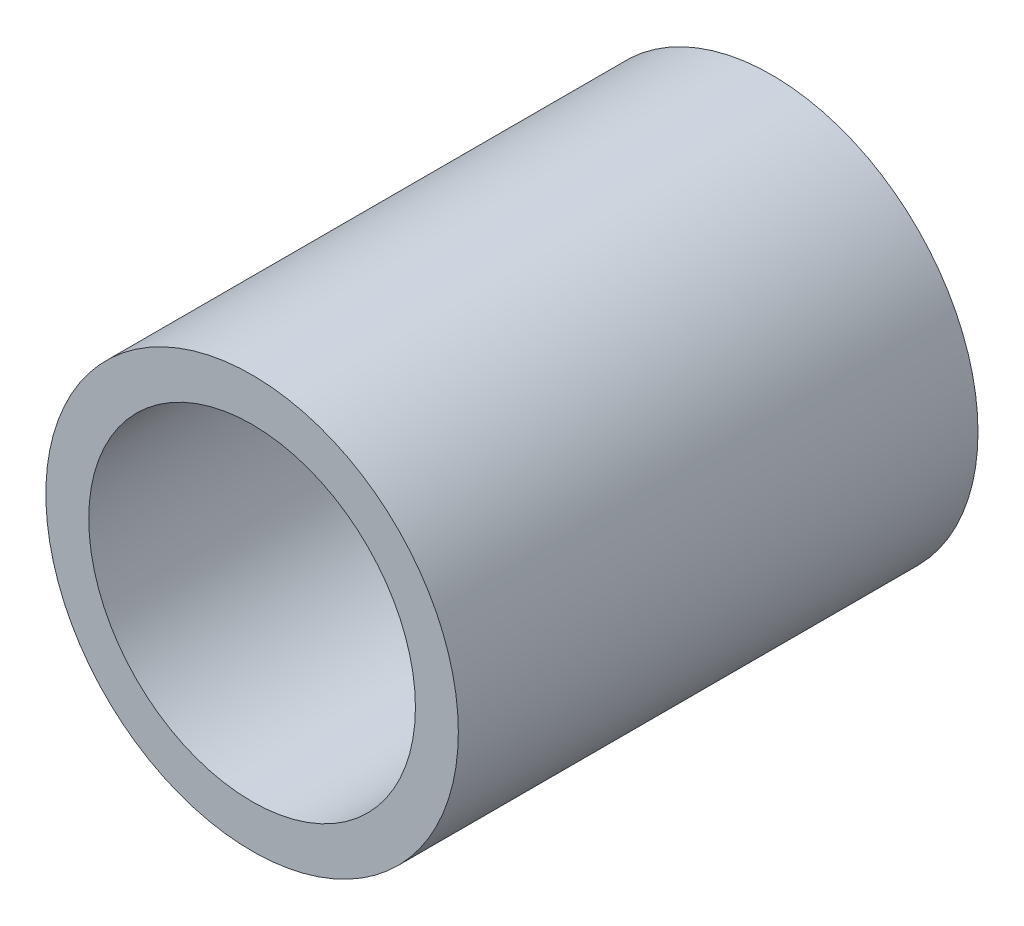
ISO-10303-21;
HEADER;
FILE_DESCRIPTION(('STEP AP214'),'2;1');
FILE_NAME('part.step','',(''),(''),'','','');
FILE_SCHEMA(('AUTOMOTIVE_DESIGN { 1 0 10303 214 1 1 1 1 }'));
ENDSEC;
DATA;
#1=APPLICATION_CONTEXT('core data for automotive mechanical design processes');
#2=APPLICATION_PROTOCOL_DEFINITION('international standard','automotive_design',2000,#1);
#3=PRODUCT_CONTEXT('',#1,'mechanical');
#4=PRODUCT('Part','Part','',(#3));
#5=PRODUCT_RELATED_PRODUCT_CATEGORY('part','',(#4));
#6=PRODUCT_DEFINITION_FORMATION('','',#4);
#7=PRODUCT_DEFINITION_CONTEXT('part definition',#1,'design');
#8=PRODUCT_DEFINITION('design','',#6,#7);
#9=PRODUCT_DEFINITION_SHAPE('','',#8);
#10=(LENGTH_UNIT() NAMED_UNIT(*) SI_UNIT(.MILLI.,.METRE.));
#11=(NAMED_UNIT(*) PLANE_ANGLE_UNIT() SI_UNIT($,.RADIAN.));
#12=(NAMED_UNIT(*) SI_UNIT($,.STERADIAN.) SOLID_ANGLE_UNIT());
#13=UNCERTAINTY_MEASURE_WITH_UNIT(LENGTH_MEASURE(1.E-05),#10,'distance_accuracy_value','');
#14=(GEOMETRIC_REPRESENTATION_CONTEXT(3) GLOBAL_UNCERTAINTY_ASSIGNED_CONTEXT((#13)) GLOBAL_UNIT_ASSIGNED_CONTEXT((#10,
#11,#12)) REPRESENTATION_CONTEXT('',''));
#15=CARTESIAN_POINT('',(0.,0.,0.));
#16=DIRECTION('',(0.,0.,1.));
#17=DIRECTION('',(1.,0.,0.));
#18=AXIS2_PLACEMENT_3D('',#15,#16,#17);
#19=CARTESIAN_POINT('',(0.,0.,20.));
#20=DIRECTION('',(0.,0.,1.));
#21=DIRECTION('',(1.,0.,0.));
#22=AXIS2_PLACEMENT_3D('',#19,#20,#21);
#23=PLANE('',#22);
#24=CARTESIAN_POINT('',(0.,0.,20.));
#25=DIRECTION('',(0.,0.,1.));
#26=DIRECTION('',(1.,0.,0.));
#27=AXIS2_PLACEMENT_3D('',#24,#25,#26);
#28=CIRCLE('',#27,7.9375);
#29=CARTESIAN_POINT('',(7.9375,0.,20.));
#30=VERTEX_POINT('',#29);
#31=EDGE_CURVE('E10',#30,#30,#28,.T.);
#32=ORIENTED_EDGE('',*,*,#31,.T.);
#33=EDGE_LOOP('',(#32));
#34=FACE_BOUND('',#33,.T.);
#35=CARTESIAN_POINT('',(0.,0.,20.));
#36=DIRECTION('',(0.,0.,1.));
#37=DIRECTION('',(1.,0.,0.));
#38=AXIS2_PLACEMENT_3D('',#35,#36,#37);
#39=CIRCLE('',#38,6.2865);
#40=CARTESIAN_POINT('',(6.2865,0.,20.));
#41=VERTEX_POINT('',#40);
#42=EDGE_CURVE('E56',#41,#41,#39,.T.);
#43=ORIENTED_EDGE('',*,*,#42,.F.);
#44=EDGE_LOOP('',(#43));
#45=FACE_BOUND('',#44,.T.);
#46=ADVANCED_FACE('F43',(#34,#45),#23,.T.);
#47=CARTESIAN_POINT('',(0.,0.,0.));
#48=DIRECTION('',(0.,0.,1.));
#49=DIRECTION('',(1.,0.,0.));
#50=AXIS2_PLACEMENT_3D('',#47,#48,#49);
#51=PLANE('',#50);
#52=CARTESIAN_POINT('',(0.,0.,0.));
#53=DIRECTION('',(0.,0.,1.));
#54=DIRECTION('',(1.,0.,0.));
#55=AXIS2_PLACEMENT_3D('',#52,#53,#54);
#56=CIRCLE('',#55,7.9375);
#57=CARTESIAN_POINT('',(7.9375,0.,0.));
#58=VERTEX_POINT('',#57);
#59=EDGE_CURVE('E47',#58,#58,#56,.T.);
#60=ORIENTED_EDGE('',*,*,#59,.F.);
#61=EDGE_LOOP('',(#60));
#62=FACE_BOUND('',#61,.T.);
#63=CARTESIAN_POINT('',(0.,0.,0.));
#64=DIRECTION('',(0.,0.,1.));
#65=DIRECTION('',(1.,0.,0.));
#66=AXIS2_PLACEMENT_3D('',#63,#64,#65);
#67=CIRCLE('',#66,6.2865);
#68=CARTESIAN_POINT('',(6.2865,0.,0.));
#69=VERTEX_POINT('',#68);
#70=EDGE_CURVE('E58',#69,#69,#67,.T.);
#71=ORIENTED_EDGE('',*,*,#70,.T.);
#72=EDGE_LOOP('',(#71));
#73=FACE_BOUND('',#72,.T.);
#74=ADVANCED_FACE('F70',(#62,#73),#51,.F.);
#75=CARTESIAN_POINT('',(0.,0.,20.));
#76=DIRECTION('',(0.,0.,-1.));
#77=DIRECTION('',(-1.,0.,0.));
#78=AXIS2_PLACEMENT_3D('',#75,#76,#77);
#79=CYLINDRICAL_SURFACE('',#78,7.9375);
#80=ORIENTED_EDGE('',*,*,#31,.F.);
#81=EDGE_LOOP('',(#80));
#82=FACE_BOUND('',#81,.T.);
#83=ORIENTED_EDGE('',*,*,#59,.T.);
#84=EDGE_LOOP('',(#83));
#85=FACE_BOUND('',#84,.T.);
#86=ADVANCED_FACE('F45',(#82,#85),#79,.T.);
#87=CARTESIAN_POINT('',(0.,0.,20.));
#88=DIRECTION('',(0.,0.,-1.));
#89=DIRECTION('',(-1.,0.,0.));
#90=AXIS2_PLACEMENT_3D('',#87,#88,#89);
#91=CYLINDRICAL_SURFACE('',#90,6.2865);
#92=ORIENTED_EDGE('',*,*,#42,.T.);
#93=EDGE_LOOP('',(#92));
#94=FACE_BOUND('',#93,.T.);
#95=ORIENTED_EDGE('',*,*,#70,.F.);
#96=EDGE_LOOP('',(#95));
#97=FACE_BOUND('',#96,.T.);
#98=ADVANCED_FACE('F66',(#94,#97),#91,.F.);
#99=CLOSED_SHELL('',(#46,#74,#86,#98));
#100=MANIFOLD_SOLID_BREP('B2',#99);
#101=ADVANCED_BREP_SHAPE_REPRESENTATION('',(#18,#100),#14);
#102=SHAPE_DEFINITION_REPRESENTATION(#9,#101);
ENDSEC;
END-ISO-10303-21;
